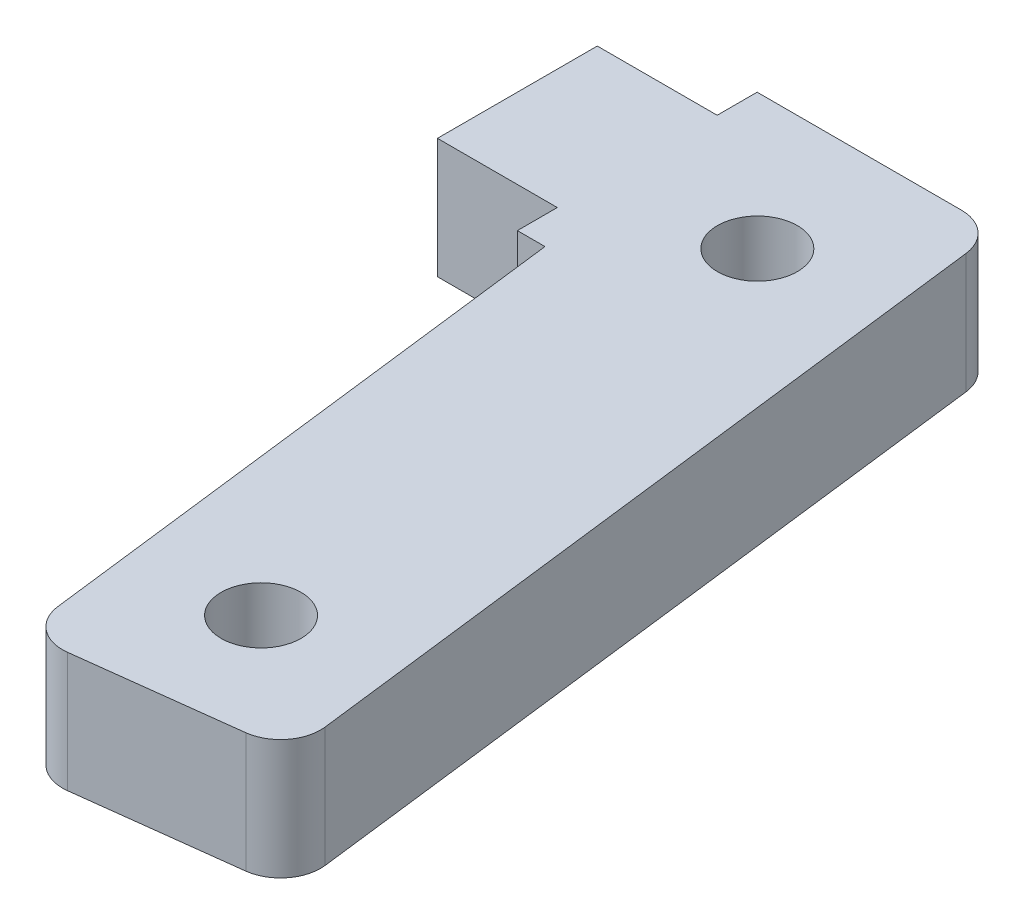
ISO-10303-21;
HEADER;
FILE_DESCRIPTION(('STEP AP214'),'2;1');
FILE_NAME('part.step','',(''),(''),'','','');
FILE_SCHEMA(('AUTOMOTIVE_DESIGN { 1 0 10303 214 1 1 1 1 }'));
ENDSEC;
DATA;
#1=APPLICATION_CONTEXT('core data for automotive mechanical design processes');
#2=APPLICATION_PROTOCOL_DEFINITION('international standard','automotive_design',2000,#1);
#3=PRODUCT_CONTEXT('',#1,'mechanical');
#4=PRODUCT('Part','Part','',(#3));
#5=PRODUCT_RELATED_PRODUCT_CATEGORY('part','',(#4));
#6=PRODUCT_DEFINITION_FORMATION('','',#4);
#7=PRODUCT_DEFINITION_CONTEXT('part definition',#1,'design');
#8=PRODUCT_DEFINITION('design','',#6,#7);
#9=PRODUCT_DEFINITION_SHAPE('','',#8);
#10=(LENGTH_UNIT() NAMED_UNIT(*) SI_UNIT(.MILLI.,.METRE.));
#11=(NAMED_UNIT(*) PLANE_ANGLE_UNIT() SI_UNIT($,.RADIAN.));
#12=(NAMED_UNIT(*) SI_UNIT($,.STERADIAN.) SOLID_ANGLE_UNIT());
#13=UNCERTAINTY_MEASURE_WITH_UNIT(LENGTH_MEASURE(1.E-05),#10,'distance_accuracy_value','');
#14=(GEOMETRIC_REPRESENTATION_CONTEXT(3) GLOBAL_UNCERTAINTY_ASSIGNED_CONTEXT((#13)) GLOBAL_UNIT_ASSIGNED_CONTEXT((#10,
#11,#12)) REPRESENTATION_CONTEXT('',''));
#15=CARTESIAN_POINT('',(0.,0.,0.));
#16=DIRECTION('',(0.,0.,1.));
#17=DIRECTION('',(1.,0.,0.));
#18=AXIS2_PLACEMENT_3D('',#15,#16,#17);
#19=CARTESIAN_POINT('',(0.,3.,0.));
#20=DIRECTION('',(0.,-1.,0.));
#21=DIRECTION('',(0.,0.,-1.));
#22=AXIS2_PLACEMENT_3D('',#19,#20,#21);
#23=PLANE('',#22);
#24=DIRECTION('',(0.121869343405144,0.,0.992546151641322));
#25=VECTOR('',#24,1.);
#26=CARTESIAN_POINT('',(15.4398871595285,3.,-13.9333416231385));
#27=LINE('',#26,#25);
#28=CARTESIAN_POINT('',(15.4398871595285,3.,-13.9333416231385));
#29=VERTEX_POINT('',#28);
#30=CARTESIAN_POINT('',(17.1460579672006,3.,-0.0376955001600201));
#31=VERTEX_POINT('',#30);
#32=EDGE_CURVE('E287',#29,#31,#27,.T.);
#33=ORIENTED_EDGE('',*,*,#32,.T.);
#34=CARTESIAN_POINT('',(18.1386041188419,3.,-0.159564843565165));
#35=DIRECTION('',(0.,-1.,0.));
#36=DIRECTION('',(0.,0.,-1.));
#37=AXIS2_PLACEMENT_3D('',#34,#35,#36);
#38=CIRCLE('',#37,1.);
#39=CARTESIAN_POINT('',(18.260473462247,3.,0.832981308076158));
#40=VERTEX_POINT('',#39);
#41=EDGE_CURVE('E200',#31,#40,#38,.F.);
#42=ORIENTED_EDGE('',*,*,#41,.T.);
#43=DIRECTION('',(0.992546151641322,0.,-0.121869343405144));
#44=VECTOR('',#43,1.);
#45=CARTESIAN_POINT('',(17.2679273106057,3.,0.954850651481302));
#46=LINE('',#45,#44);
#47=CARTESIAN_POINT('',(22.2306580688123,3.,0.34550393445558));
#48=VERTEX_POINT('',#47);
#49=EDGE_CURVE('E286',#40,#48,#46,.T.);
#50=ORIENTED_EDGE('',*,*,#49,.T.);
#51=CARTESIAN_POINT('',(22.1087887254072,3.,-0.647042217185743));
#52=DIRECTION('',(0.,-1.,0.));
#53=DIRECTION('',(0.,0.,-1.));
#54=AXIS2_PLACEMENT_3D('',#51,#52,#53);
#55=CIRCLE('',#54,1.);
#56=CARTESIAN_POINT('',(23.1013348770485,3.,-0.768911560590887));
#57=VERTEX_POINT('',#56);
#58=EDGE_CURVE('E197',#48,#57,#55,.F.);
#59=ORIENTED_EDGE('',*,*,#58,.T.);
#60=DIRECTION('',(-0.121869343405145,0.,-0.992546151641322));
#61=VECTOR('',#60,1.);
#62=CARTESIAN_POINT('',(23.2232042204536,3.,0.223634591050435));
#63=LINE('',#62,#61);
#64=CARTESIAN_POINT('',(20.8560596339496,3.,-19.0552109665437));
#65=VERTEX_POINT('',#64);
#66=EDGE_CURVE('E210',#57,#65,#63,.T.);
#67=ORIENTED_EDGE('',*,*,#66,.T.);
#68=CARTESIAN_POINT('',(19.8635134823083,3.,-18.9333416231385));
#69=DIRECTION('',(0.,-1.,0.));
#70=DIRECTION('',(0.,0.,-1.));
#71=AXIS2_PLACEMENT_3D('',#68,#69,#70);
#72=CIRCLE('',#71,1.);
#73=CARTESIAN_POINT('',(19.8635134823083,3.,-19.9333416231385));
#74=VERTEX_POINT('',#73);
#75=EDGE_CURVE('E59',#65,#74,#72,.F.);
#76=ORIENTED_EDGE('',*,*,#75,.T.);
#77=DIRECTION('',(-1.,0.,0.));
#78=VECTOR('',#77,1.);
#79=CARTESIAN_POINT('',(20.7482387468642,3.,-19.9333416231385));
#80=LINE('',#79,#78);
#81=CARTESIAN_POINT('',(14.7482387468642,3.,-19.9333416231385));
#82=VERTEX_POINT('',#81);
#83=EDGE_CURVE('E157',#74,#82,#80,.T.);
#84=ORIENTED_EDGE('',*,*,#83,.T.);
#85=DIRECTION('',(0.,0.,1.));
#86=VECTOR('',#85,1.);
#87=CARTESIAN_POINT('',(14.7482387468642,3.,-19.9333416231385));
#88=LINE('',#87,#86);
#89=CARTESIAN_POINT('',(14.7482387468642,3.,-18.9333416231385));
#90=VERTEX_POINT('',#89);
#91=EDGE_CURVE('E152',#82,#90,#88,.T.);
#92=ORIENTED_EDGE('',*,*,#91,.T.);
#93=DIRECTION('',(-1.,0.,0.));
#94=VECTOR('',#93,1.);
#95=CARTESIAN_POINT('',(14.7482387468642,3.,-18.9333416231385));
#96=LINE('',#95,#94);
#97=CARTESIAN_POINT('',(11.7482387468642,3.,-18.9333416231385));
#98=VERTEX_POINT('',#97);
#99=EDGE_CURVE('E141',#90,#98,#96,.T.);
#100=ORIENTED_EDGE('',*,*,#99,.T.);
#101=DIRECTION('',(0.,0.,1.));
#102=VECTOR('',#101,1.);
#103=CARTESIAN_POINT('',(11.7482387468642,3.,-18.9333416231385));
#104=LINE('',#103,#102);
#105=CARTESIAN_POINT('',(11.7482387468642,3.,-14.9333416231385));
#106=VERTEX_POINT('',#105);
#107=EDGE_CURVE('E151',#98,#106,#104,.T.);
#108=ORIENTED_EDGE('',*,*,#107,.T.);
#109=DIRECTION('',(1.,0.,0.));
#110=VECTOR('',#109,1.);
#111=CARTESIAN_POINT('',(11.7482387468642,3.,-14.9333416231385));
#112=LINE('',#111,#110);
#113=CARTESIAN_POINT('',(14.7482387468642,3.,-14.9333416231385));
#114=VERTEX_POINT('',#113);
#115=EDGE_CURVE('E254',#106,#114,#112,.T.);
#116=ORIENTED_EDGE('',*,*,#115,.T.);
#117=DIRECTION('',(0.,0.,1.));
#118=VECTOR('',#117,1.);
#119=CARTESIAN_POINT('',(14.7482387468642,3.,-14.9333416231385));
#120=LINE('',#119,#118);
#121=CARTESIAN_POINT('',(14.7482387468642,3.,-13.9333416231385));
#122=VERTEX_POINT('',#121);
#123=EDGE_CURVE('E308',#114,#122,#120,.T.);
#124=ORIENTED_EDGE('',*,*,#123,.T.);
#125=DIRECTION('',(1.,0.,0.));
#126=VECTOR('',#125,1.);
#127=CARTESIAN_POINT('',(14.7482387468642,3.,-13.9333416231385));
#128=LINE('',#127,#126);
#129=EDGE_CURVE('E295',#122,#29,#128,.T.);
#130=ORIENTED_EDGE('',*,*,#129,.T.);
#131=EDGE_LOOP('',(#33,#42,#50,#59,#67,#76,#84,#92,#100,#108,#116,#124,#130));
#132=FACE_BOUND('',#131,.T.);
#133=CARTESIAN_POINT('',(18.1415955193313,3.,-16.546219937925));
#134=DIRECTION('',(0.,1.,0.));
#135=DIRECTION('',(0.,0.,1.));
#136=AXIS2_PLACEMENT_3D('',#133,#134,#135);
#137=CIRCLE('',#136,1.);
#138=CARTESIAN_POINT('',(18.1415955193313,3.,-15.546219937925));
#139=VERTEX_POINT('',#138);
#140=EDGE_CURVE('E302',#139,#139,#137,.T.);
#141=ORIENTED_EDGE('',*,*,#140,.F.);
#142=EDGE_LOOP('',(#141));
#143=FACE_BOUND('',#142,.T.);
#144=CARTESIAN_POINT('',(19.8799577353142,3.,-2.3883958336581));
#145=DIRECTION('',(0.,1.,0.));
#146=DIRECTION('',(0.,0.,1.));
#147=AXIS2_PLACEMENT_3D('',#144,#145,#146);
#148=CIRCLE('',#147,1.);
#149=CARTESIAN_POINT('',(19.8799577353142,3.,-1.3883958336581));
#150=VERTEX_POINT('',#149);
#151=EDGE_CURVE('E484',#150,#150,#148,.T.);
#152=ORIENTED_EDGE('',*,*,#151,.F.);
#153=EDGE_LOOP('',(#152));
#154=FACE_BOUND('',#153,.T.);
#155=ADVANCED_FACE('F43',(#132,#143,#154),#23,.F.);
#156=CARTESIAN_POINT('',(0.,0.,0.));
#157=DIRECTION('',(0.,-1.,0.));
#158=DIRECTION('',(0.,0.,-1.));
#159=AXIS2_PLACEMENT_3D('',#156,#157,#158);
#160=PLANE('',#159);
#161=CARTESIAN_POINT('',(18.1415955193313,0.,-16.546219937925));
#162=DIRECTION('',(0.,1.,0.));
#163=DIRECTION('',(0.,0.,1.));
#164=AXIS2_PLACEMENT_3D('',#161,#162,#163);
#165=CIRCLE('',#164,1.);
#166=CARTESIAN_POINT('',(18.1415955193313,0.,-15.546219937925));
#167=VERTEX_POINT('',#166);
#168=EDGE_CURVE('E489',#167,#167,#165,.T.);
#169=ORIENTED_EDGE('',*,*,#168,.T.);
#170=EDGE_LOOP('',(#169));
#171=FACE_BOUND('',#170,.T.);
#172=DIRECTION('',(0.992546151641322,0.,-0.121869343405144));
#173=VECTOR('',#172,1.);
#174=CARTESIAN_POINT('',(17.2679273106057,0.,0.954850651481302));
#175=LINE('',#174,#173);
#176=CARTESIAN_POINT('',(18.260473462247,0.,0.832981308076158));
#177=VERTEX_POINT('',#176);
#178=CARTESIAN_POINT('',(22.2306580688123,0.,0.34550393445558));
#179=VERTEX_POINT('',#178);
#180=EDGE_CURVE('E220',#177,#179,#175,.T.);
#181=ORIENTED_EDGE('',*,*,#180,.F.);
#182=CARTESIAN_POINT('',(18.1386041188419,0.,-0.159564843565165));
#183=DIRECTION('',(0.,-1.,0.));
#184=DIRECTION('',(0.,0.,-1.));
#185=AXIS2_PLACEMENT_3D('',#182,#183,#184);
#186=CIRCLE('',#185,1.);
#187=CARTESIAN_POINT('',(17.1460579672006,0.,-0.0376955001600201));
#188=VERTEX_POINT('',#187);
#189=EDGE_CURVE('E189',#177,#188,#186,.T.);
#190=ORIENTED_EDGE('',*,*,#189,.T.);
#191=DIRECTION('',(0.121869343405144,0.,0.992546151641322));
#192=VECTOR('',#191,1.);
#193=CARTESIAN_POINT('',(15.4398871595285,0.,-13.9333416231385));
#194=LINE('',#193,#192);
#195=CARTESIAN_POINT('',(15.4398871595285,0.,-13.9333416231385));
#196=VERTEX_POINT('',#195);
#197=EDGE_CURVE('E226',#196,#188,#194,.T.);
#198=ORIENTED_EDGE('',*,*,#197,.F.);
#199=DIRECTION('',(1.,0.,0.));
#200=VECTOR('',#199,1.);
#201=CARTESIAN_POINT('',(14.7482387468642,0.,-13.9333416231385));
#202=LINE('',#201,#200);
#203=CARTESIAN_POINT('',(14.7482387468642,0.,-13.9333416231385));
#204=VERTEX_POINT('',#203);
#205=EDGE_CURVE('E264',#204,#196,#202,.T.);
#206=ORIENTED_EDGE('',*,*,#205,.F.);
#207=DIRECTION('',(0.,0.,1.));
#208=VECTOR('',#207,1.);
#209=CARTESIAN_POINT('',(14.7482387468642,0.,-14.9333416231385));
#210=LINE('',#209,#208);
#211=CARTESIAN_POINT('',(14.7482387468642,0.,-14.9333416231385));
#212=VERTEX_POINT('',#211);
#213=EDGE_CURVE('E260',#212,#204,#210,.T.);
#214=ORIENTED_EDGE('',*,*,#213,.F.);
#215=DIRECTION('',(1.,0.,0.));
#216=VECTOR('',#215,1.);
#217=CARTESIAN_POINT('',(11.7482387468642,0.,-14.9333416231385));
#218=LINE('',#217,#216);
#219=CARTESIAN_POINT('',(11.7482387468642,0.,-14.9333416231385));
#220=VERTEX_POINT('',#219);
#221=EDGE_CURVE('E253',#220,#212,#218,.T.);
#222=ORIENTED_EDGE('',*,*,#221,.F.);
#223=DIRECTION('',(0.,0.,1.));
#224=VECTOR('',#223,1.);
#225=CARTESIAN_POINT('',(11.7482387468642,0.,-18.9333416231385));
#226=LINE('',#225,#224);
#227=CARTESIAN_POINT('',(11.7482387468642,0.,-18.9333416231385));
#228=VERTEX_POINT('',#227);
#229=EDGE_CURVE('E258',#228,#220,#226,.T.);
#230=ORIENTED_EDGE('',*,*,#229,.F.);
#231=DIRECTION('',(-1.,0.,0.));
#232=VECTOR('',#231,1.);
#233=CARTESIAN_POINT('',(14.7482387468642,0.,-18.9333416231385));
#234=LINE('',#233,#232);
#235=CARTESIAN_POINT('',(14.7482387468642,0.,-18.9333416231385));
#236=VERTEX_POINT('',#235);
#237=EDGE_CURVE('E266',#236,#228,#234,.T.);
#238=ORIENTED_EDGE('',*,*,#237,.F.);
#239=DIRECTION('',(0.,0.,1.));
#240=VECTOR('',#239,1.);
#241=CARTESIAN_POINT('',(14.7482387468642,0.,-19.9333416231385));
#242=LINE('',#241,#240);
#243=CARTESIAN_POINT('',(14.7482387468642,0.,-19.9333416231385));
#244=VERTEX_POINT('',#243);
#245=EDGE_CURVE('E166',#244,#236,#242,.T.);
#246=ORIENTED_EDGE('',*,*,#245,.F.);
#247=DIRECTION('',(-1.,0.,0.));
#248=VECTOR('',#247,1.);
#249=CARTESIAN_POINT('',(20.7482387468642,0.,-19.9333416231385));
#250=LINE('',#249,#248);
#251=CARTESIAN_POINT('',(19.8635134823083,0.,-19.9333416231385));
#252=VERTEX_POINT('',#251);
#253=EDGE_CURVE('E162',#252,#244,#250,.T.);
#254=ORIENTED_EDGE('',*,*,#253,.F.);
#255=CARTESIAN_POINT('',(19.8635134823083,0.,-18.9333416231385));
#256=DIRECTION('',(0.,-1.,0.));
#257=DIRECTION('',(0.,0.,-1.));
#258=AXIS2_PLACEMENT_3D('',#255,#256,#257);
#259=CIRCLE('',#258,1.);
#260=CARTESIAN_POINT('',(20.8560596339496,0.,-19.0552109665437));
#261=VERTEX_POINT('',#260);
#262=EDGE_CURVE('E183',#252,#261,#259,.T.);
#263=ORIENTED_EDGE('',*,*,#262,.T.);
#264=DIRECTION('',(-0.121869343405145,0.,-0.992546151641322));
#265=VECTOR('',#264,1.);
#266=CARTESIAN_POINT('',(23.2232042204536,0.,0.223634591050435));
#267=LINE('',#266,#265);
#268=CARTESIAN_POINT('',(23.1013348770485,0.,-0.768911560590887));
#269=VERTEX_POINT('',#268);
#270=EDGE_CURVE('E209',#269,#261,#267,.T.);
#271=ORIENTED_EDGE('',*,*,#270,.F.);
#272=CARTESIAN_POINT('',(22.1087887254072,0.,-0.647042217185743));
#273=DIRECTION('',(0.,-1.,0.));
#274=DIRECTION('',(0.,0.,-1.));
#275=AXIS2_PLACEMENT_3D('',#272,#273,#274);
#276=CIRCLE('',#275,1.);
#277=EDGE_CURVE('E186',#269,#179,#276,.T.);
#278=ORIENTED_EDGE('',*,*,#277,.T.);
#279=EDGE_LOOP('',(#181,#190,#198,#206,#214,#222,#230,#238,#246,#254,#263,#271,#278));
#280=FACE_BOUND('',#279,.T.);
#281=CARTESIAN_POINT('',(19.8799577353142,0.,-2.3883958336581));
#282=DIRECTION('',(0.,1.,0.));
#283=DIRECTION('',(0.,0.,1.));
#284=AXIS2_PLACEMENT_3D('',#281,#282,#283);
#285=CIRCLE('',#284,1.);
#286=CARTESIAN_POINT('',(19.8799577353142,0.,-1.3883958336581));
#287=VERTEX_POINT('',#286);
#288=EDGE_CURVE('E487',#287,#287,#285,.T.);
#289=ORIENTED_EDGE('',*,*,#288,.T.);
#290=EDGE_LOOP('',(#289));
#291=FACE_BOUND('',#290,.T.);
#292=ADVANCED_FACE('F215',(#171,#280,#291),#160,.T.);
#293=CARTESIAN_POINT('',(14.7482387468642,3.,-19.9333416231385));
#294=DIRECTION('',(1.,0.,0.));
#295=DIRECTION('',(0.,0.,-1.));
#296=AXIS2_PLACEMENT_3D('',#293,#294,#295);
#297=PLANE('',#296);
#298=ORIENTED_EDGE('',*,*,#245,.T.);
#299=DIRECTION('',(0.,-1.,0.));
#300=VECTOR('',#299,1.);
#301=CARTESIAN_POINT('',(14.7482387468642,3.,-18.9333416231385));
#302=LINE('',#301,#300);
#303=EDGE_CURVE('E145',#90,#236,#302,.T.);
#304=ORIENTED_EDGE('',*,*,#303,.F.);
#305=ORIENTED_EDGE('',*,*,#91,.F.);
#306=DIRECTION('',(0.,-1.,0.));
#307=VECTOR('',#306,1.);
#308=CARTESIAN_POINT('',(14.7482387468642,3.,-19.9333416231385));
#309=LINE('',#308,#307);
#310=EDGE_CURVE('E230',#82,#244,#309,.T.);
#311=ORIENTED_EDGE('',*,*,#310,.T.);
#312=EDGE_LOOP('',(#298,#304,#305,#311));
#313=FACE_BOUND('',#312,.T.);
#314=ADVANCED_FACE('F164',(#313),#297,.F.);
#315=CARTESIAN_POINT('',(14.7482387468642,3.,-18.9333416231385));
#316=DIRECTION('',(0.,0.,1.));
#317=DIRECTION('',(1.,0.,0.));
#318=AXIS2_PLACEMENT_3D('',#315,#316,#317);
#319=PLANE('',#318);
#320=ORIENTED_EDGE('',*,*,#237,.T.);
#321=DIRECTION('',(0.,-1.,0.));
#322=VECTOR('',#321,1.);
#323=CARTESIAN_POINT('',(11.7482387468642,3.,-18.9333416231385));
#324=LINE('',#323,#322);
#325=EDGE_CURVE('E148',#98,#228,#324,.T.);
#326=ORIENTED_EDGE('',*,*,#325,.F.);
#327=ORIENTED_EDGE('',*,*,#99,.F.);
#328=ORIENTED_EDGE('',*,*,#303,.T.);
#329=EDGE_LOOP('',(#320,#326,#327,#328));
#330=FACE_BOUND('',#329,.T.);
#331=ADVANCED_FACE('F143',(#330),#319,.F.);
#332=CARTESIAN_POINT('',(11.7482387468642,3.,-18.9333416231385));
#333=DIRECTION('',(1.,0.,0.));
#334=DIRECTION('',(0.,0.,-1.));
#335=AXIS2_PLACEMENT_3D('',#332,#333,#334);
#336=PLANE('',#335);
#337=ORIENTED_EDGE('',*,*,#229,.T.);
#338=DIRECTION('',(0.,-1.,0.));
#339=VECTOR('',#338,1.);
#340=CARTESIAN_POINT('',(11.7482387468642,3.,-14.9333416231385));
#341=LINE('',#340,#339);
#342=EDGE_CURVE('E176',#106,#220,#341,.T.);
#343=ORIENTED_EDGE('',*,*,#342,.F.);
#344=ORIENTED_EDGE('',*,*,#107,.F.);
#345=ORIENTED_EDGE('',*,*,#325,.T.);
#346=EDGE_LOOP('',(#337,#343,#344,#345));
#347=FACE_BOUND('',#346,.T.);
#348=ADVANCED_FACE('F303',(#347),#336,.F.);
#349=CARTESIAN_POINT('',(11.7482387468642,3.,-14.9333416231385));
#350=DIRECTION('',(0.,0.,-1.));
#351=DIRECTION('',(-1.,0.,0.));
#352=AXIS2_PLACEMENT_3D('',#349,#350,#351);
#353=PLANE('',#352);
#354=ORIENTED_EDGE('',*,*,#221,.T.);
#355=DIRECTION('',(0.,-1.,0.));
#356=VECTOR('',#355,1.);
#357=CARTESIAN_POINT('',(14.7482387468642,3.,-14.9333416231385));
#358=LINE('',#357,#356);
#359=EDGE_CURVE('E241',#114,#212,#358,.T.);
#360=ORIENTED_EDGE('',*,*,#359,.F.);
#361=ORIENTED_EDGE('',*,*,#115,.F.);
#362=ORIENTED_EDGE('',*,*,#342,.T.);
#363=EDGE_LOOP('',(#354,#360,#361,#362));
#364=FACE_BOUND('',#363,.T.);
#365=ADVANCED_FACE('F251',(#364),#353,.F.);
#366=CARTESIAN_POINT('',(14.7482387468642,3.,-14.9333416231385));
#367=DIRECTION('',(1.,0.,0.));
#368=DIRECTION('',(0.,0.,-1.));
#369=AXIS2_PLACEMENT_3D('',#366,#367,#368);
#370=PLANE('',#369);
#371=ORIENTED_EDGE('',*,*,#213,.T.);
#372=DIRECTION('',(0.,-1.,0.));
#373=VECTOR('',#372,1.);
#374=CARTESIAN_POINT('',(14.7482387468642,3.,-13.9333416231385));
#375=LINE('',#374,#373);
#376=EDGE_CURVE('E237',#122,#204,#375,.T.);
#377=ORIENTED_EDGE('',*,*,#376,.F.);
#378=ORIENTED_EDGE('',*,*,#123,.F.);
#379=ORIENTED_EDGE('',*,*,#359,.T.);
#380=EDGE_LOOP('',(#371,#377,#378,#379));
#381=FACE_BOUND('',#380,.T.);
#382=ADVANCED_FACE('F319',(#381),#370,.F.);
#383=CARTESIAN_POINT('',(14.7482387468642,3.,-13.9333416231385));
#384=DIRECTION('',(0.,0.,-1.));
#385=DIRECTION('',(-1.,0.,0.));
#386=AXIS2_PLACEMENT_3D('',#383,#384,#385);
#387=PLANE('',#386);
#388=ORIENTED_EDGE('',*,*,#205,.T.);
#389=DIRECTION('',(0.,-1.,0.));
#390=VECTOR('',#389,1.);
#391=CARTESIAN_POINT('',(15.4398871595285,3.,-13.9333416231385));
#392=LINE('',#391,#390);
#393=EDGE_CURVE('E233',#29,#196,#392,.T.);
#394=ORIENTED_EDGE('',*,*,#393,.F.);
#395=ORIENTED_EDGE('',*,*,#129,.F.);
#396=ORIENTED_EDGE('',*,*,#376,.T.);
#397=EDGE_LOOP('',(#388,#394,#395,#396));
#398=FACE_BOUND('',#397,.T.);
#399=ADVANCED_FACE('F317',(#398),#387,.F.);
#400=CARTESIAN_POINT('',(15.4398871595285,3.,-13.9333416231385));
#401=DIRECTION('',(0.992546151641322,0.,-0.121869343405144));
#402=DIRECTION('',(-0.121869343405144,0.,-0.992546151641322));
#403=AXIS2_PLACEMENT_3D('',#400,#401,#402);
#404=PLANE('',#403);
#405=ORIENTED_EDGE('',*,*,#197,.T.);
#406=DIRECTION('',(0.,-1.,0.));
#407=VECTOR('',#406,1.);
#408=CARTESIAN_POINT('',(17.1460579672006,3.,-0.0376955001600201));
#409=LINE('',#408,#407);
#410=EDGE_CURVE('E192',#188,#31,#409,.F.);
#411=ORIENTED_EDGE('',*,*,#410,.T.);
#412=ORIENTED_EDGE('',*,*,#32,.F.);
#413=ORIENTED_EDGE('',*,*,#393,.T.);
#414=EDGE_LOOP('',(#405,#411,#412,#413));
#415=FACE_BOUND('',#414,.T.);
#416=ADVANCED_FACE('F277',(#415),#404,.F.);
#417=CARTESIAN_POINT('',(17.2679273106057,3.,0.954850651481302));
#418=DIRECTION('',(-0.121869343405144,0.,-0.992546151641322));
#419=DIRECTION('',(-0.992546151641322,0.,0.121869343405144));
#420=AXIS2_PLACEMENT_3D('',#417,#418,#419);
#421=PLANE('',#420);
#422=ORIENTED_EDGE('',*,*,#49,.F.);
#423=DIRECTION('',(0.,-1.,0.));
#424=VECTOR('',#423,1.);
#425=CARTESIAN_POINT('',(18.260473462247,3.,0.832981308076158));
#426=LINE('',#425,#424);
#427=EDGE_CURVE('E173',#40,#177,#426,.T.);
#428=ORIENTED_EDGE('',*,*,#427,.T.);
#429=ORIENTED_EDGE('',*,*,#180,.T.);
#430=DIRECTION('',(0.,-1.,0.));
#431=VECTOR('',#430,1.);
#432=CARTESIAN_POINT('',(22.2306580688123,3.,0.34550393445558));
#433=LINE('',#432,#431);
#434=EDGE_CURVE('E168',#179,#48,#433,.F.);
#435=ORIENTED_EDGE('',*,*,#434,.T.);
#436=EDGE_LOOP('',(#422,#428,#429,#435));
#437=FACE_BOUND('',#436,.T.);
#438=ADVANCED_FACE('F289',(#437),#421,.F.);
#439=CARTESIAN_POINT('',(23.2232042204536,3.,0.223634591050435));
#440=DIRECTION('',(-0.992546151641322,0.,0.121869343405145));
#441=DIRECTION('',(0.121869343405145,0.,0.992546151641322));
#442=AXIS2_PLACEMENT_3D('',#439,#440,#441);
#443=PLANE('',#442);
#444=ORIENTED_EDGE('',*,*,#66,.F.);
#445=DIRECTION('',(0.,-1.,0.));
#446=VECTOR('',#445,1.);
#447=CARTESIAN_POINT('',(23.1013348770485,3.,-0.768911560590887));
#448=LINE('',#447,#446);
#449=EDGE_CURVE('E52',#57,#269,#448,.T.);
#450=ORIENTED_EDGE('',*,*,#449,.T.);
#451=ORIENTED_EDGE('',*,*,#270,.T.);
#452=DIRECTION('',(0.,-1.,0.));
#453=VECTOR('',#452,1.);
#454=CARTESIAN_POINT('',(20.8560596339496,3.,-19.0552109665437));
#455=LINE('',#454,#453);
#456=EDGE_CURVE('E67',#261,#65,#455,.F.);
#457=ORIENTED_EDGE('',*,*,#456,.T.);
#458=EDGE_LOOP('',(#444,#450,#451,#457));
#459=FACE_BOUND('',#458,.T.);
#460=ADVANCED_FACE('F208',(#459),#443,.F.);
#461=CARTESIAN_POINT('',(20.7482387468642,3.,-19.9333416231385));
#462=DIRECTION('',(0.,0.,1.));
#463=DIRECTION('',(1.,0.,0.));
#464=AXIS2_PLACEMENT_3D('',#461,#462,#463);
#465=PLANE('',#464);
#466=ORIENTED_EDGE('',*,*,#83,.F.);
#467=DIRECTION('',(0.,-1.,0.));
#468=VECTOR('',#467,1.);
#469=CARTESIAN_POINT('',(19.8635134823083,3.,-19.9333416231385));
#470=LINE('',#469,#468);
#471=EDGE_CURVE('E11',#74,#252,#470,.T.);
#472=ORIENTED_EDGE('',*,*,#471,.T.);
#473=ORIENTED_EDGE('',*,*,#253,.T.);
#474=ORIENTED_EDGE('',*,*,#310,.F.);
#475=EDGE_LOOP('',(#466,#472,#473,#474));
#476=FACE_BOUND('',#475,.T.);
#477=ADVANCED_FACE('F337',(#476),#465,.F.);
#478=CARTESIAN_POINT('',(18.1415955193313,3.,-16.546219937925));
#479=DIRECTION('',(0.,-1.,0.));
#480=DIRECTION('',(0.,0.,-1.));
#481=AXIS2_PLACEMENT_3D('',#478,#479,#480);
#482=CYLINDRICAL_SURFACE('',#481,1.);
#483=ORIENTED_EDGE('',*,*,#140,.T.);
#484=EDGE_LOOP('',(#483));
#485=FACE_BOUND('',#484,.T.);
#486=ORIENTED_EDGE('',*,*,#168,.F.);
#487=EDGE_LOOP('',(#486));
#488=FACE_BOUND('',#487,.T.);
#489=ADVANCED_FACE('F334',(#485,#488),#482,.F.);
#490=CARTESIAN_POINT('',(19.8799577353142,3.,-2.3883958336581));
#491=DIRECTION('',(0.,-1.,0.));
#492=DIRECTION('',(0.,0.,-1.));
#493=AXIS2_PLACEMENT_3D('',#490,#491,#492);
#494=CYLINDRICAL_SURFACE('',#493,1.);
#495=ORIENTED_EDGE('',*,*,#151,.T.);
#496=EDGE_LOOP('',(#495));
#497=FACE_BOUND('',#496,.T.);
#498=ORIENTED_EDGE('',*,*,#288,.F.);
#499=EDGE_LOOP('',(#498));
#500=FACE_BOUND('',#499,.T.);
#501=ADVANCED_FACE('F364',(#497,#500),#494,.F.);
#502=CARTESIAN_POINT('',(18.1386041188419,3.,-0.159564843565165));
#503=DIRECTION('',(0.,-1.,0.));
#504=DIRECTION('',(0.,0.,-1.));
#505=AXIS2_PLACEMENT_3D('',#502,#503,#504);
#506=CYLINDRICAL_SURFACE('',#505,1.);
#507=ORIENTED_EDGE('',*,*,#41,.F.);
#508=ORIENTED_EDGE('',*,*,#410,.F.);
#509=ORIENTED_EDGE('',*,*,#189,.F.);
#510=ORIENTED_EDGE('',*,*,#427,.F.);
#511=EDGE_LOOP('',(#507,#508,#509,#510));
#512=FACE_BOUND('',#511,.T.);
#513=ADVANCED_FACE('F282',(#512),#506,.T.);
#514=CARTESIAN_POINT('',(22.1087887254072,3.,-0.647042217185743));
#515=DIRECTION('',(0.,-1.,0.));
#516=DIRECTION('',(0.,0.,-1.));
#517=AXIS2_PLACEMENT_3D('',#514,#515,#516);
#518=CYLINDRICAL_SURFACE('',#517,1.);
#519=ORIENTED_EDGE('',*,*,#58,.F.);
#520=ORIENTED_EDGE('',*,*,#434,.F.);
#521=ORIENTED_EDGE('',*,*,#277,.F.);
#522=ORIENTED_EDGE('',*,*,#449,.F.);
#523=EDGE_LOOP('',(#519,#520,#521,#522));
#524=FACE_BOUND('',#523,.T.);
#525=ADVANCED_FACE('F374',(#524),#518,.T.);
#526=CARTESIAN_POINT('',(19.8635134823083,3.,-18.9333416231385));
#527=DIRECTION('',(0.,-1.,0.));
#528=DIRECTION('',(0.,0.,-1.));
#529=AXIS2_PLACEMENT_3D('',#526,#527,#528);
#530=CYLINDRICAL_SURFACE('',#529,1.);
#531=ORIENTED_EDGE('',*,*,#75,.F.);
#532=ORIENTED_EDGE('',*,*,#456,.F.);
#533=ORIENTED_EDGE('',*,*,#262,.F.);
#534=ORIENTED_EDGE('',*,*,#471,.F.);
#535=EDGE_LOOP('',(#531,#532,#533,#534));
#536=FACE_BOUND('',#535,.T.);
#537=ADVANCED_FACE('F45',(#536),#530,.T.);
#538=CLOSED_SHELL('',(#155,#292,#314,#331,#348,#365,#382,#399,#416,#438,#460,#477,#489,#501,
#513,#525,#537));
#539=MANIFOLD_SOLID_BREP('B2',#538);
#540=ADVANCED_BREP_SHAPE_REPRESENTATION('',(#18,#539),#14);
#541=SHAPE_DEFINITION_REPRESENTATION(#9,#540);
ENDSEC;
END-ISO-10303-21;
